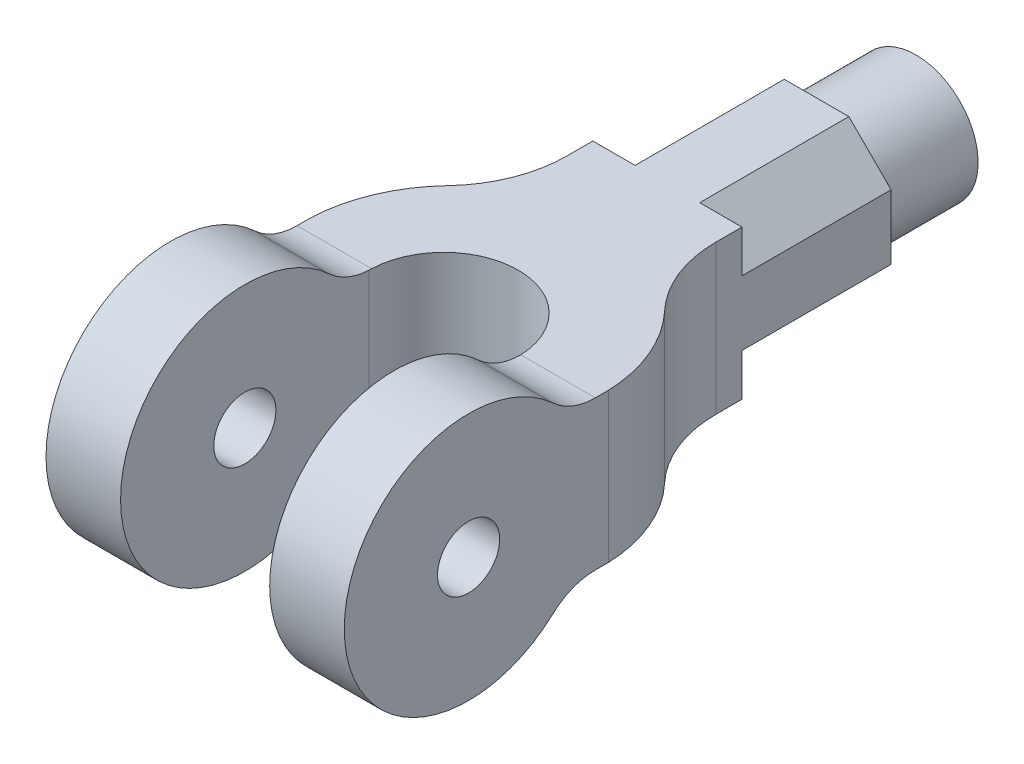
ISO-10303-21;
HEADER;
FILE_DESCRIPTION(('STEP AP214'),'2;1');
FILE_NAME('part.step','',(''),(''),'','','');
FILE_SCHEMA(('AUTOMOTIVE_DESIGN { 1 0 10303 214 1 1 1 1 }'));
ENDSEC;
DATA;
#1=APPLICATION_CONTEXT('core data for automotive mechanical design processes');
#2=APPLICATION_PROTOCOL_DEFINITION('international standard','automotive_design',2000,#1);
#3=PRODUCT_CONTEXT('',#1,'mechanical');
#4=PRODUCT('Part','Part','',(#3));
#5=PRODUCT_RELATED_PRODUCT_CATEGORY('part','',(#4));
#6=PRODUCT_DEFINITION_FORMATION('','',#4);
#7=PRODUCT_DEFINITION_CONTEXT('part definition',#1,'design');
#8=PRODUCT_DEFINITION('design','',#6,#7);
#9=PRODUCT_DEFINITION_SHAPE('','',#8);
#10=(LENGTH_UNIT() NAMED_UNIT(*) SI_UNIT(.MILLI.,.METRE.));
#11=(NAMED_UNIT(*) PLANE_ANGLE_UNIT() SI_UNIT($,.RADIAN.));
#12=(NAMED_UNIT(*) SI_UNIT($,.STERADIAN.) SOLID_ANGLE_UNIT());
#13=UNCERTAINTY_MEASURE_WITH_UNIT(LENGTH_MEASURE(1.E-05),#10,'distance_accuracy_value','');
#14=(GEOMETRIC_REPRESENTATION_CONTEXT(3) GLOBAL_UNCERTAINTY_ASSIGNED_CONTEXT((#13)) GLOBAL_UNIT_ASSIGNED_CONTEXT((#10,
#11,#12)) REPRESENTATION_CONTEXT('',''));
#15=CARTESIAN_POINT('',(0.,0.,0.));
#16=DIRECTION('',(0.,0.,1.));
#17=DIRECTION('',(1.,0.,0.));
#18=AXIS2_PLACEMENT_3D('',#15,#16,#17);
#19=CARTESIAN_POINT('',(0.,100.,0.));
#20=DIRECTION('',(-1.,0.,0.));
#21=DIRECTION('',(0.,0.,1.));
#22=AXIS2_PLACEMENT_3D('',#19,#20,#21);
#23=PLANE('',#22);
#24=CARTESIAN_POINT('',(0.,50.,-50.));
#25=DIRECTION('',(1.,0.,0.));
#26=DIRECTION('',(0.,0.,-1.));
#27=AXIS2_PLACEMENT_3D('',#24,#25,#26);
#28=CIRCLE('',#27,12.5);
#29=CARTESIAN_POINT('',(0.,50.,-62.5));
#30=VERTEX_POINT('',#29);
#31=EDGE_CURVE('E412',#30,#30,#28,.T.);
#32=ORIENTED_EDGE('',*,*,#31,.F.);
#33=EDGE_LOOP('',(#32));
#34=FACE_BOUND('',#33,.T.);
#35=DIRECTION('',(0.,0.,-1.));
#36=VECTOR('',#35,1.);
#37=CARTESIAN_POINT('',(0.,20.,0.));
#38=LINE('',#37,#36);
#39=CARTESIAN_POINT('',(0.,20.,-100.990195135928));
#40=VERTEX_POINT('',#39);
#41=CARTESIAN_POINT('',(0.,20.,-106.283063455047));
#42=VERTEX_POINT('',#41);
#43=EDGE_CURVE('E334',#40,#42,#38,.T.);
#44=ORIENTED_EDGE('',*,*,#43,.T.);
#45=DIRECTION('',(0.,1.,0.));
#46=VECTOR('',#45,1.);
#47=CARTESIAN_POINT('',(0.,0.,-106.283063455047));
#48=LINE('',#47,#46);
#49=CARTESIAN_POINT('',(0.,80.,-106.283063455047));
#50=VERTEX_POINT('',#49);
#51=EDGE_CURVE('E436',#42,#50,#48,.T.);
#52=ORIENTED_EDGE('',*,*,#51,.T.);
#53=DIRECTION('',(0.,0.,-1.));
#54=VECTOR('',#53,1.);
#55=CARTESIAN_POINT('',(0.,80.,0.));
#56=LINE('',#55,#54);
#57=CARTESIAN_POINT('',(0.,80.,-100.990195135928));
#58=VERTEX_POINT('',#57);
#59=EDGE_CURVE('E357',#58,#50,#56,.T.);
#60=ORIENTED_EDGE('',*,*,#59,.F.);
#61=CARTESIAN_POINT('',(0.,105.,-100.990195135928));
#62=DIRECTION('',(1.,0.,0.));
#63=DIRECTION('',(0.,0.,-1.));
#64=AXIS2_PLACEMENT_3D('',#61,#62,#63);
#65=CIRCLE('',#64,25.);
#66=CARTESIAN_POINT('',(0.,86.6666666666667,-83.9934634239519));
#67=VERTEX_POINT('',#66);
#68=EDGE_CURVE('E329',#58,#67,#65,.F.);
#69=ORIENTED_EDGE('',*,*,#68,.T.);
#70=CARTESIAN_POINT('',(0.,50.,-50.));
#71=DIRECTION('',(1.,0.,0.));
#72=DIRECTION('',(0.,0.,-1.));
#73=AXIS2_PLACEMENT_3D('',#70,#71,#72);
#74=CIRCLE('',#73,50.);
#75=CARTESIAN_POINT('',(0.,13.3333333333333,-83.9934634239519));
#76=VERTEX_POINT('',#75);
#77=EDGE_CURVE('E422',#67,#76,#74,.T.);
#78=ORIENTED_EDGE('',*,*,#77,.T.);
#79=CARTESIAN_POINT('',(0.,-5.,-100.990195135928));
#80=DIRECTION('',(1.,0.,0.));
#81=DIRECTION('',(0.,0.,-1.));
#82=AXIS2_PLACEMENT_3D('',#79,#80,#81);
#83=CIRCLE('',#82,25.);
#84=EDGE_CURVE('E337',#76,#40,#83,.F.);
#85=ORIENTED_EDGE('',*,*,#84,.T.);
#86=EDGE_LOOP('',(#44,#52,#60,#69,#78,#85));
#87=FACE_BOUND('',#86,.T.);
#88=ADVANCED_FACE('F85',(#34,#87),#23,.F.);
#89=CARTESIAN_POINT('',(-120.,100.,0.));
#90=DIRECTION('',(1.,0.,0.));
#91=DIRECTION('',(0.,0.,-1.));
#92=AXIS2_PLACEMENT_3D('',#89,#90,#91);
#93=PLANE('',#92);
#94=CARTESIAN_POINT('',(-120.,50.,-50.));
#95=DIRECTION('',(1.,0.,0.));
#96=DIRECTION('',(0.,0.,-1.));
#97=AXIS2_PLACEMENT_3D('',#94,#95,#96);
#98=CIRCLE('',#97,12.5);
#99=CARTESIAN_POINT('',(-120.,50.,-62.5));
#100=VERTEX_POINT('',#99);
#101=EDGE_CURVE('E413',#100,#100,#98,.T.);
#102=ORIENTED_EDGE('',*,*,#101,.T.);
#103=EDGE_LOOP('',(#102));
#104=FACE_BOUND('',#103,.T.);
#105=DIRECTION('',(0.,0.,-1.));
#106=VECTOR('',#105,1.);
#107=CARTESIAN_POINT('',(-120.,20.,0.));
#108=LINE('',#107,#106);
#109=CARTESIAN_POINT('',(-120.,20.,-100.990195135928));
#110=VERTEX_POINT('',#109);
#111=CARTESIAN_POINT('',(-120.,20.,-106.283063455047));
#112=VERTEX_POINT('',#111);
#113=EDGE_CURVE('E333',#110,#112,#108,.T.);
#114=ORIENTED_EDGE('',*,*,#113,.F.);
#115=CARTESIAN_POINT('',(-120.,-5.,-100.990195135928));
#116=DIRECTION('',(1.,0.,0.));
#117=DIRECTION('',(0.,0.,-1.));
#118=AXIS2_PLACEMENT_3D('',#115,#116,#117);
#119=CIRCLE('',#118,25.);
#120=CARTESIAN_POINT('',(-120.,13.3333333333333,-83.9934634239519));
#121=VERTEX_POINT('',#120);
#122=EDGE_CURVE('E331',#121,#110,#119,.F.);
#123=ORIENTED_EDGE('',*,*,#122,.F.);
#124=CARTESIAN_POINT('',(-120.,50.,-50.));
#125=DIRECTION('',(1.,0.,0.));
#126=DIRECTION('',(0.,0.,-1.));
#127=AXIS2_PLACEMENT_3D('',#124,#125,#126);
#128=CIRCLE('',#127,50.);
#129=CARTESIAN_POINT('',(-120.,86.6666666666667,-83.9934634239519));
#130=VERTEX_POINT('',#129);
#131=EDGE_CURVE('E423',#130,#121,#128,.T.);
#132=ORIENTED_EDGE('',*,*,#131,.F.);
#133=CARTESIAN_POINT('',(-120.,105.,-100.990195135928));
#134=DIRECTION('',(1.,0.,0.));
#135=DIRECTION('',(0.,0.,-1.));
#136=AXIS2_PLACEMENT_3D('',#133,#134,#135);
#137=CIRCLE('',#136,25.);
#138=CARTESIAN_POINT('',(-120.,80.,-100.990195135928));
#139=VERTEX_POINT('',#138);
#140=EDGE_CURVE('E353',#139,#130,#137,.F.);
#141=ORIENTED_EDGE('',*,*,#140,.F.);
#142=DIRECTION('',(0.,0.,-1.));
#143=VECTOR('',#142,1.);
#144=CARTESIAN_POINT('',(-120.,80.,0.));
#145=LINE('',#144,#143);
#146=CARTESIAN_POINT('',(-120.,80.,-106.283063455047));
#147=VERTEX_POINT('',#146);
#148=EDGE_CURVE('E356',#139,#147,#145,.T.);
#149=ORIENTED_EDGE('',*,*,#148,.T.);
#150=DIRECTION('',(0.,1.,0.));
#151=VECTOR('',#150,1.);
#152=CARTESIAN_POINT('',(-120.,0.,-106.283063455047));
#153=LINE('',#152,#151);
#154=EDGE_CURVE('E442',#112,#147,#153,.T.);
#155=ORIENTED_EDGE('',*,*,#154,.F.);
#156=EDGE_LOOP('',(#114,#123,#132,#141,#149,#155));
#157=FACE_BOUND('',#156,.T.);
#158=ADVANCED_FACE('F533',(#104,#157),#93,.F.);
#159=CARTESIAN_POINT('',(-30.,0.,0.));
#160=DIRECTION('',(-1.,0.,0.));
#161=DIRECTION('',(0.,0.,1.));
#162=AXIS2_PLACEMENT_3D('',#159,#160,#161);
#163=PLANE('',#162);
#164=CARTESIAN_POINT('',(-30.,50.,-50.));
#165=DIRECTION('',(-1.,0.,0.));
#166=DIRECTION('',(0.,0.,1.));
#167=AXIS2_PLACEMENT_3D('',#164,#165,#166);
#168=CIRCLE('',#167,12.5);
#169=CARTESIAN_POINT('',(-30.,50.,-37.5));
#170=VERTEX_POINT('',#169);
#171=EDGE_CURVE('E419',#170,#170,#168,.T.);
#172=ORIENTED_EDGE('',*,*,#171,.F.);
#173=EDGE_LOOP('',(#172));
#174=FACE_BOUND('',#173,.T.);
#175=DIRECTION('',(0.,1.,0.));
#176=VECTOR('',#175,1.);
#177=CARTESIAN_POINT('',(-30.,0.,-100.));
#178=LINE('',#177,#176);
#179=CARTESIAN_POINT('',(-30.,19.9803825749884,-100.));
#180=VERTEX_POINT('',#179);
#181=CARTESIAN_POINT('',(-30.,80.0196174250116,-100.));
#182=VERTEX_POINT('',#181);
#183=EDGE_CURVE('E432',#180,#182,#178,.T.);
#184=ORIENTED_EDGE('',*,*,#183,.F.);
#185=CARTESIAN_POINT('',(-30.,-5.,-100.990195135928));
#186=DIRECTION('',(-1.,0.,0.));
#187=DIRECTION('',(0.,0.,1.));
#188=AXIS2_PLACEMENT_3D('',#185,#186,#187);
#189=CIRCLE('',#188,25.);
#190=CARTESIAN_POINT('',(-30.,13.3333333333333,-83.9934634239519));
#191=VERTEX_POINT('',#190);
#192=EDGE_CURVE('E406',#180,#191,#189,.F.);
#193=ORIENTED_EDGE('',*,*,#192,.T.);
#194=CARTESIAN_POINT('',(-30.,50.,-50.));
#195=DIRECTION('',(-1.,0.,0.));
#196=DIRECTION('',(0.,0.,1.));
#197=AXIS2_PLACEMENT_3D('',#194,#195,#196);
#198=CIRCLE('',#197,50.);
#199=CARTESIAN_POINT('',(-30.,86.6666666666667,-83.9934634239519));
#200=VERTEX_POINT('',#199);
#201=EDGE_CURVE('E425',#191,#200,#198,.T.);
#202=ORIENTED_EDGE('',*,*,#201,.T.);
#203=CARTESIAN_POINT('',(-30.,105.,-100.990195135928));
#204=DIRECTION('',(-1.,0.,0.));
#205=DIRECTION('',(0.,0.,1.));
#206=AXIS2_PLACEMENT_3D('',#203,#204,#205);
#207=CIRCLE('',#206,25.);
#208=EDGE_CURVE('E401',#200,#182,#207,.F.);
#209=ORIENTED_EDGE('',*,*,#208,.T.);
#210=EDGE_LOOP('',(#184,#193,#202,#209));
#211=FACE_BOUND('',#210,.T.);
#212=ADVANCED_FACE('F526',(#174,#211),#163,.T.);
#213=CARTESIAN_POINT('',(-90.,0.,0.));
#214=DIRECTION('',(-1.,0.,0.));
#215=DIRECTION('',(0.,0.,1.));
#216=AXIS2_PLACEMENT_3D('',#213,#214,#215);
#217=PLANE('',#216);
#218=CARTESIAN_POINT('',(-90.,50.,-50.));
#219=DIRECTION('',(-1.,0.,0.));
#220=DIRECTION('',(0.,0.,1.));
#221=AXIS2_PLACEMENT_3D('',#218,#219,#220);
#222=CIRCLE('',#221,12.5);
#223=CARTESIAN_POINT('',(-90.,50.,-37.5));
#224=VERTEX_POINT('',#223);
#225=EDGE_CURVE('E416',#224,#224,#222,.T.);
#226=ORIENTED_EDGE('',*,*,#225,.T.);
#227=EDGE_LOOP('',(#226));
#228=FACE_BOUND('',#227,.T.);
#229=CARTESIAN_POINT('',(-90.,-5.,-100.990195135928));
#230=DIRECTION('',(-1.,0.,0.));
#231=DIRECTION('',(0.,0.,1.));
#232=AXIS2_PLACEMENT_3D('',#229,#230,#231);
#233=CIRCLE('',#232,25.);
#234=CARTESIAN_POINT('',(-89.9999999999999,19.9803825749884,-100.));
#235=VERTEX_POINT('',#234);
#236=CARTESIAN_POINT('',(-90.,13.3333333333333,-83.9934634239519));
#237=VERTEX_POINT('',#236);
#238=EDGE_CURVE('E409',#235,#237,#233,.F.);
#239=ORIENTED_EDGE('',*,*,#238,.F.);
#240=DIRECTION('',(0.,1.,0.));
#241=VECTOR('',#240,1.);
#242=CARTESIAN_POINT('',(-90.,0.,-100.));
#243=LINE('',#242,#241);
#244=CARTESIAN_POINT('',(-89.9999999999999,80.0196174250116,-100.));
#245=VERTEX_POINT('',#244);
#246=EDGE_CURVE('E451',#235,#245,#243,.T.);
#247=ORIENTED_EDGE('',*,*,#246,.T.);
#248=CARTESIAN_POINT('',(-90.,105.,-100.990195135928));
#249=DIRECTION('',(-1.,0.,0.));
#250=DIRECTION('',(0.,0.,1.));
#251=AXIS2_PLACEMENT_3D('',#248,#249,#250);
#252=CIRCLE('',#251,25.);
#253=CARTESIAN_POINT('',(-90.,86.6666666666667,-83.9934634239519));
#254=VERTEX_POINT('',#253);
#255=EDGE_CURVE('E404',#254,#245,#252,.F.);
#256=ORIENTED_EDGE('',*,*,#255,.F.);
#257=CARTESIAN_POINT('',(-90.,50.,-50.));
#258=DIRECTION('',(-1.,0.,0.));
#259=DIRECTION('',(0.,0.,1.));
#260=AXIS2_PLACEMENT_3D('',#257,#258,#259);
#261=CIRCLE('',#260,50.);
#262=EDGE_CURVE('E454',#237,#254,#261,.T.);
#263=ORIENTED_EDGE('',*,*,#262,.F.);
#264=EDGE_LOOP('',(#239,#247,#256,#263));
#265=FACE_BOUND('',#264,.T.);
#266=ADVANCED_FACE('F523',(#228,#265),#217,.F.);
#267=CARTESIAN_POINT('',(0.,100.,-250.));
#268=DIRECTION('',(0.,0.,1.));
#269=DIRECTION('',(1.,0.,0.));
#270=AXIS2_PLACEMENT_3D('',#267,#268,#269);
#271=PLANE('',#270);
#272=CARTESIAN_POINT('',(-60.,50.,-250.));
#273=DIRECTION('',(0.,0.,-1.));
#274=DIRECTION('',(-1.,0.,0.));
#275=AXIS2_PLACEMENT_3D('',#272,#273,#274);
#276=CIRCLE('',#275,25.);
#277=CARTESIAN_POINT('',(-85.,50.,-250.));
#278=VERTEX_POINT('',#277);
#279=EDGE_CURVE('E12',#278,#278,#276,.T.);
#280=ORIENTED_EDGE('',*,*,#279,.F.);
#281=EDGE_LOOP('',(#280));
#282=FACE_BOUND('',#281,.T.);
#283=DIRECTION('',(0.,1.,0.));
#284=VECTOR('',#283,1.);
#285=CARTESIAN_POINT('',(-30.,0.,-250.));
#286=LINE('',#285,#284);
#287=CARTESIAN_POINT('',(-30.,37.0000000000006,-250.));
#288=VERTEX_POINT('',#287);
#289=CARTESIAN_POINT('',(-30.,62.9999999999993,-250.));
#290=VERTEX_POINT('',#289);
#291=EDGE_CURVE('E433',#288,#290,#286,.T.);
#292=ORIENTED_EDGE('',*,*,#291,.F.);
#293=DIRECTION('',(0.707106781186543,0.707106781186552,0.));
#294=VECTOR('',#293,1.);
#295=CARTESIAN_POINT('',(-33.5000000000005,33.5,-250.));
#296=LINE('',#295,#294);
#297=CARTESIAN_POINT('',(-47.0000000000004,20.,-250.));
#298=VERTEX_POINT('',#297);
#299=EDGE_CURVE('E308',#298,#288,#296,.T.);
#300=ORIENTED_EDGE('',*,*,#299,.F.);
#301=DIRECTION('',(1.,0.,0.));
#302=VECTOR('',#301,1.);
#303=CARTESIAN_POINT('',(-120.,20.,-250.));
#304=LINE('',#303,#302);
#305=CARTESIAN_POINT('',(-73.0000000000003,20.,-250.));
#306=VERTEX_POINT('',#305);
#307=EDGE_CURVE('E347',#306,#298,#304,.T.);
#308=ORIENTED_EDGE('',*,*,#307,.F.);
#309=DIRECTION('',(0.70710678118655,-0.707106781186545,0.));
#310=VECTOR('',#309,1.);
#311=CARTESIAN_POINT('',(-26.4999999999999,-26.5,-250.));
#312=LINE('',#311,#310);
#313=CARTESIAN_POINT('',(-90.,36.9999999999996,-250.));
#314=VERTEX_POINT('',#313);
#315=EDGE_CURVE('E295',#314,#306,#312,.T.);
#316=ORIENTED_EDGE('',*,*,#315,.F.);
#317=DIRECTION('',(0.,1.,0.));
#318=VECTOR('',#317,1.);
#319=CARTESIAN_POINT('',(-90.,0.,-250.));
#320=LINE('',#319,#318);
#321=CARTESIAN_POINT('',(-90.,63.,-250.));
#322=VERTEX_POINT('',#321);
#323=EDGE_CURVE('E445',#314,#322,#320,.T.);
#324=ORIENTED_EDGE('',*,*,#323,.T.);
#325=DIRECTION('',(-0.707106781186548,-0.707106781186548,0.));
#326=VECTOR('',#325,1.);
#327=CARTESIAN_POINT('',(-76.5000000000001,76.5,-250.));
#328=LINE('',#327,#326);
#329=CARTESIAN_POINT('',(-73.,80.,-250.));
#330=VERTEX_POINT('',#329);
#331=EDGE_CURVE('E269',#330,#322,#328,.T.);
#332=ORIENTED_EDGE('',*,*,#331,.F.);
#333=DIRECTION('',(1.,0.,0.));
#334=VECTOR('',#333,1.);
#335=CARTESIAN_POINT('',(-120.,80.,-250.));
#336=LINE('',#335,#334);
#337=CARTESIAN_POINT('',(-47.000000000001,80.,-250.));
#338=VERTEX_POINT('',#337);
#339=EDGE_CURVE('E367',#330,#338,#336,.T.);
#340=ORIENTED_EDGE('',*,*,#339,.T.);
#341=DIRECTION('',(-0.707106781186555,0.70710678118654,0.));
#342=VECTOR('',#341,1.);
#343=CARTESIAN_POINT('',(16.4999999999999,16.5000000000004,-250.));
#344=LINE('',#343,#342);
#345=EDGE_CURVE('E289',#290,#338,#344,.T.);
#346=ORIENTED_EDGE('',*,*,#345,.F.);
#347=EDGE_LOOP('',(#292,#300,#308,#316,#324,#332,#340,#346));
#348=FACE_BOUND('',#347,.T.);
#349=ADVANCED_FACE('F525',(#282,#348),#271,.F.);
#350=CARTESIAN_POINT('',(-60.,0.,-100.));
#351=DIRECTION('',(0.,1.,0.));
#352=DIRECTION('',(0.,0.,1.));
#353=AXIS2_PLACEMENT_3D('',#350,#351,#352);
#354=CYLINDRICAL_SURFACE('',#353,30.);
#355=CARTESIAN_POINT('',(-75.8275095013903,0.,-125.48509256376));
#356=CARTESIAN_POINT('',(-75.9453419018727,0.358389813404725,-125.41192525404));
#357=CARTESIAN_POINT('',(-76.0728764345803,0.711927766841105,-125.331578001654));
#358=CARTESIAN_POINT('',(-76.3441422714206,1.40900113180079,-125.157399989291));
#359=CARTESIAN_POINT('',(-76.487859720743,1.75254478742493,-125.063580744539));
#360=CARTESIAN_POINT('',(-76.7879919439526,2.42880706693594,-124.863543107349));
#361=CARTESIAN_POINT('',(-76.9443626457572,2.76155805131275,-124.757367231674));
#362=CARTESIAN_POINT('',(-77.267691156014,3.41777472815168,-124.532950019776));
#363=CARTESIAN_POINT('',(-77.4346514883452,3.74123818018271,-124.414705803124));
#364=CARTESIAN_POINT('',(-77.9475160759389,4.69728164591437,-124.042967440581));
#365=CARTESIAN_POINT('',(-78.3058698439156,5.31653073050685,-123.772163302132));
#366=CARTESIAN_POINT('',(-79.0421203351865,6.52251393927723,-123.186623209702));
#367=CARTESIAN_POINT('',(-79.4200382267979,7.1092113585892,-122.87183901651));
#368=CARTESIAN_POINT('',(-80.0332816772886,8.02478326006208,-122.332984513027));
#369=CARTESIAN_POINT('',(-80.2657241611245,8.36363846324906,-122.122441780078));
#370=CARTESIAN_POINT('',(-80.7321616366253,9.03015713595407,-121.68592911087));
#371=CARTESIAN_POINT('',(-80.9661566766426,9.35782025493677,-121.45995869208));
#372=CARTESIAN_POINT('',(-81.6679284445677,10.3240452775369,-120.759037096425));
#373=CARTESIAN_POINT('',(-82.1356596397262,10.9460896508651,-120.26093016345));
#374=CARTESIAN_POINT('',(-83.0598406241308,12.1449590889212,-119.202556211609));
#375=CARTESIAN_POINT('',(-83.516281927936,12.7217508091336,-118.642244077417));
#376=CARTESIAN_POINT('',(-84.4074040713771,13.8261350899429,-117.45928387493));
#377=CARTESIAN_POINT('',(-84.8420915990132,14.353742815286,-116.836655144113));
#378=CARTESIAN_POINT('',(-85.5703006530869,15.2235618363571,-115.699965570892));
#379=CARTESIAN_POINT('',(-85.8710459721243,15.5782107910711,-115.200005781658));
#380=CARTESIAN_POINT('',(-86.4510798000706,16.2547596983813,-114.166559470197));
#381=CARTESIAN_POINT('',(-86.7303703085069,16.5766627037158,-113.63307608072));
#382=CARTESIAN_POINT('',(-87.2628402930686,17.183915487848,-112.534331326578));
#383=CARTESIAN_POINT('',(-87.5160593923424,17.4693209001455,-111.969120263849));
#384=CARTESIAN_POINT('',(-87.8732800320289,17.8674921879339,-111.098590933037));
#385=CARTESIAN_POINT('',(-87.9885823708282,17.9952230023255,-110.80463844569));
#386=CARTESIAN_POINT('',(-88.211172660222,18.2402860780741,-110.209345813758));
#387=CARTESIAN_POINT('',(-88.3184584894051,18.3576155884515,-109.908003741491));
#388=CARTESIAN_POINT('',(-88.5950928397935,18.6580766529537,-109.089265592646));
#389=CARTESIAN_POINT('',(-88.7565448902082,18.8311523973944,-108.565427882586));
#390=CARTESIAN_POINT('',(-89.052494190088,19.143807601573,-107.500529935665));
#391=CARTESIAN_POINT('',(-89.1869963227463,19.2833931304804,-106.9594728395));
#392=CARTESIAN_POINT('',(-89.4267044634109,19.5267881537235,-105.863712445825));
#393=CARTESIAN_POINT('',(-89.5319479041772,19.6306434011941,-105.30902758194));
#394=CARTESIAN_POINT('',(-89.7114766042342,19.8009443206672,-104.189217129798));
#395=CARTESIAN_POINT('',(-89.7857750136936,19.8674058874296,-103.624096083264));
#396=CARTESIAN_POINT('',(-89.8958210311018,19.9565087313528,-102.54931302129));
#397=CARTESIAN_POINT('',(-89.9348892238173,19.9831384788008,-102.040324076569));
#398=CARTESIAN_POINT('',(-89.9739568211406,19.9996720025189,-101.275581240453));
#399=CARTESIAN_POINT('',(-89.9837235703496,20.0012832281562,-101.020505246894));
#400=CARTESIAN_POINT('',(-89.9967466695036,19.9966949503395,-100.510242873675));
#401=CARTESIAN_POINT('',(-90.0000026489206,19.9904950023841,-100.25505648856));
#402=CARTESIAN_POINT('',(-90.,19.9803825749884,-100.));
#403=B_SPLINE_CURVE_WITH_KNOTS('',3,(#355,#356,#357,#358,#359,#360,#361,#362,#363,#364,#365,
#366,#367,#368,#369,#370,#371,#372,#373,#374,#375,#376,#377,#378,#379,#380,#381,#382,#383,#384,
#385,#386,#387,#388,#389,#390,#391,#392,#393,#394,#395,#396,#397,#398,#399,#400,#401,#402),
.UNSPECIFIED.,.F.,.F.,(4,2,2,2,2,2,2,2,2,2,2,2,2,2,2,2,2,2,2,2,2,2,2,4),(0.,1.15239393424091,
2.30380865583806,3.45137261392546,4.59921111188271,6.89142599596918,9.18617511127843,
10.5709450115355,11.9557582429984,14.7243917222752,17.4950464800166,20.2648441252873,
22.3114280428238,24.3578209925682,26.4010564573398,27.4226112042936,28.4444353351449,
30.1670290710049,31.8893103984951,33.609378039251,35.3287139853192,36.8605433198757,
37.6261694729858,38.3918391966559),.UNSPECIFIED.);
#404=CARTESIAN_POINT('',(-89.9836541067426,20.,-100.990195135928));
#405=VERTEX_POINT('',#404);
#406=EDGE_CURVE('E88',#405,#235,#403,.T.);
#407=ORIENTED_EDGE('',*,*,#406,.F.);
#408=CARTESIAN_POINT('',(-60.,20.,-100.));
#409=DIRECTION('',(0.,-1.,0.));
#410=DIRECTION('',(0.,0.,-1.));
#411=AXIS2_PLACEMENT_3D('',#408,#409,#410);
#412=CIRCLE('',#411,30.);
#413=CARTESIAN_POINT('',(-30.0163458932574,20.,-100.990195135928));
#414=VERTEX_POINT('',#413);
#415=EDGE_CURVE('E399',#414,#405,#412,.F.);
#416=ORIENTED_EDGE('',*,*,#415,.F.);
#417=CARTESIAN_POINT('',(-30.,19.9803825749884,-100.));
#418=CARTESIAN_POINT('',(-29.9999911814653,19.9921031443495,-100.295470455707));
#419=CARTESIAN_POINT('',(-30.0043649621977,19.9985645579473,-100.591145167604));
#420=CARTESIAN_POINT('',(-30.0218490987905,20.0010070519486,-101.182269660093));
#421=CARTESIAN_POINT('',(-30.0349591559513,19.9969884906565,-101.47771944803));
#422=CARTESIAN_POINT('',(-30.0698764736795,19.9785154975549,-102.067599304468));
#423=CARTESIAN_POINT('',(-30.0916783749131,19.9640674920301,-102.362029888772));
#424=CARTESIAN_POINT('',(-30.1438794394443,19.9248498442532,-102.949415323148));
#425=CARTESIAN_POINT('',(-30.1742786242004,19.9000801762385,-103.242370169535));
#426=CARTESIAN_POINT('',(-30.2776745071463,19.8109243178993,-104.113824557006));
#427=CARTESIAN_POINT('',(-30.3631401956084,19.731545621575,-104.689429220924));
#428=CARTESIAN_POINT('',(-30.5658917389764,19.5342171635541,-105.828209862136));
#429=CARTESIAN_POINT('',(-30.6831809289034,19.416263359019,-106.391384530103));
#430=CARTESIAN_POINT('',(-30.9471578583791,19.1441922940363,-107.500435065409));
#431=CARTESIAN_POINT('',(-31.0937788529506,18.990157003979,-108.04634700618));
#432=CARTESIAN_POINT('',(-31.4140968842998,18.6481818641659,-109.11918962257));
#433=CARTESIAN_POINT('',(-31.5877932751796,18.4602428231851,-109.646120750618));
#434=CARTESIAN_POINT('',(-31.9598586676402,18.0526707480773,-110.679537898761));
#435=CARTESIAN_POINT('',(-32.1582642220975,17.8329906798921,-111.185992125075));
#436=CARTESIAN_POINT('',(-32.5767632205484,17.3646528561437,-112.176002829688));
#437=CARTESIAN_POINT('',(-32.7968593386211,17.1159915269901,-112.659556473826));
#438=CARTESIAN_POINT('',(-33.3398476102806,16.4963438270936,-113.77493325495));
#439=CARTESIAN_POINT('',(-33.6709270208603,16.1138479645931,-114.396414454785));
#440=CARTESIAN_POINT('',(-34.3614999647444,15.3046093911249,-115.593106301892));
#441=CARTESIAN_POINT('',(-34.7210031017041,14.8778517098959,-116.168301176594));
#442=CARTESIAN_POINT('',(-35.4627230432031,13.9833620017027,-117.273272681042));
#443=CARTESIAN_POINT('',(-35.8449985353552,13.5155224895297,-117.802922531596));
#444=CARTESIAN_POINT('',(-36.6247714497573,12.5432717814187,-118.815068057127));
#445=CARTESIAN_POINT('',(-37.0222672254673,12.038864536157,-119.297568812776));
#446=CARTESIAN_POINT('',(-37.8343354609938,10.9845616795248,-120.225511017876));
#447=CARTESIAN_POINT('',(-38.2490912718205,10.4339306636101,-120.669955305113));
#448=CARTESIAN_POINT('',(-39.0798729287748,9.29757613830418,-121.510403914249));
#449=CARTESIAN_POINT('',(-39.4958990332364,8.71184496723211,-121.906397602526));
#450=CARTESIAN_POINT('',(-40.3181867322247,7.50753443195654,-122.647977132005));
#451=CARTESIAN_POINT('',(-40.7244843256702,6.88911782592514,-122.993785567575));
#452=CARTESIAN_POINT('',(-41.3190652656405,5.93383049801359,-123.475262582437));
#453=CARTESIAN_POINT('',(-41.5147609425322,5.61082747391488,-123.629534284819));
#454=CARTESIAN_POINT('',(-41.8993601836398,4.95514724764711,-123.925417792326));
#455=CARTESIAN_POINT('',(-42.0882646775356,4.62247138100809,-124.067031334266));
#456=CARTESIAN_POINT('',(-42.4559043938873,3.94925557890831,-124.336316229696));
#457=CARTESIAN_POINT('',(-42.6346991503793,3.6087830728379,-124.46407444937));
#458=CARTESIAN_POINT('',(-42.9808534548276,2.91758063010064,-124.706137847941));
#459=CARTESIAN_POINT('',(-43.1482181596378,2.56685542247274,-124.820449110695));
#460=CARTESIAN_POINT('',(-43.4691990562214,1.8533687959625,-125.035374687706));
#461=CARTESIAN_POINT('',(-43.6227642525342,1.49056901805244,-125.13593886043));
#462=CARTESIAN_POINT('',(-43.9120182731903,0.753672874476581,-125.32206005966));
#463=CARTESIAN_POINT('',(-44.0476859514299,0.379563776676371,-125.407599372981));
#464=CARTESIAN_POINT('',(-44.1724904986097,0.,-125.48509256376));
#465=B_SPLINE_CURVE_WITH_KNOTS('',3,(#417,#418,#419,#420,#421,#422,#423,#424,#425,#426,#427,
#428,#429,#430,#431,#432,#433,#434,#435,#436,#437,#438,#439,#440,#441,#442,#443,#444,#445,#446,
#447,#448,#449,#450,#451,#452,#453,#454,#455,#456,#457,#458,#459,#460,#461,#462,#463,#464),
.UNSPECIFIED.,.F.,.F.,(4,2,2,2,2,2,2,2,2,2,2,2,2,2,2,2,2,2,2,2,2,2,2,4),(0.,0.88702157945277,
1.77401283254117,2.66045801643428,3.54690541287115,5.3062732485925,7.06582553280981,
8.82141856192586,10.5769697168552,12.3351494576459,14.0935462240124,16.4940914992236,
18.8954513525921,21.3032927375818,23.7108743726276,26.1692726120446,28.6282094405583,
31.0758826064284,32.2994541209097,33.5228574915904,34.7380832987387,35.9527571646658,
37.1717495488665,38.392169526716),.UNSPECIFIED.);
#466=EDGE_CURVE('E597',#180,#414,#465,.T.);
#467=ORIENTED_EDGE('',*,*,#466,.F.);
#468=ORIENTED_EDGE('',*,*,#183,.T.);
#469=CARTESIAN_POINT('',(-30.0163458932574,80.,-100.990195135928));
#470=CARTESIAN_POINT('',(-30.0108963785485,79.9999994298494,-100.825142813205));
#471=CARTESIAN_POINT('',(-30.0068094634226,80.0016339301918,-100.660100390517));
#472=CARTESIAN_POINT('',(-30.0013608323368,80.0081730718623,-100.330035345207));
#473=CARTESIAN_POINT('',(-29.9999991163769,80.0130777131905,-100.165012722587));
#474=CARTESIAN_POINT('',(-30.,80.0196174250116,-100.));
#475=B_SPLINE_CURVE_WITH_KNOTS('',3,(#469,#470,#471,#472,#473,#474),.UNSPECIFIED.,.F.,.F.,(4,2,
4),(0.,0.495303323006999,0.990606646014001),.UNSPECIFIED.);
#476=CARTESIAN_POINT('',(-30.0163458932574,80.,-100.990195135928));
#477=VERTEX_POINT('',#476);
#478=EDGE_CURVE('E466',#477,#182,#475,.T.);
#479=ORIENTED_EDGE('',*,*,#478,.F.);
#480=CARTESIAN_POINT('',(-60.,80.,-100.));
#481=DIRECTION('',(0.,-1.,0.));
#482=DIRECTION('',(0.,0.,-1.));
#483=AXIS2_PLACEMENT_3D('',#480,#481,#482);
#484=CIRCLE('',#483,30.);
#485=CARTESIAN_POINT('',(-89.9836541067426,80.,-100.990195135928));
#486=VERTEX_POINT('',#485);
#487=EDGE_CURVE('E383',#477,#486,#484,.F.);
#488=ORIENTED_EDGE('',*,*,#487,.T.);
#489=CARTESIAN_POINT('',(-89.9999999999999,80.0196174250116,-100.));
#490=CARTESIAN_POINT('',(-90.000000883623,80.0130777131905,-100.165012722587));
#491=CARTESIAN_POINT('',(-89.9986391676632,80.0081730718623,-100.330035345207));
#492=CARTESIAN_POINT('',(-89.9931905365774,80.0016339301918,-100.660100390517));
#493=CARTESIAN_POINT('',(-89.9891036214515,79.9999994298494,-100.825142813205));
#494=CARTESIAN_POINT('',(-89.9836541067426,80.,-100.990195135928));
#495=B_SPLINE_CURVE_WITH_KNOTS('',3,(#489,#490,#491,#492,#493,#494),.UNSPECIFIED.,.F.,.F.,(4,2,
4),(0.,0.495303323007001,0.990606646014001),.UNSPECIFIED.);
#496=EDGE_CURVE('E473',#245,#486,#495,.T.);
#497=ORIENTED_EDGE('',*,*,#496,.F.);
#498=ORIENTED_EDGE('',*,*,#246,.F.);
#499=EDGE_LOOP('',(#407,#416,#467,#468,#479,#488,#497,#498));
#500=FACE_BOUND('',#499,.T.);
#501=ADVANCED_FACE('F478',(#500),#354,.F.);
#502=CARTESIAN_POINT('',(20.,0.,-179.561593793097));
#503=DIRECTION('',(0.,1.,0.));
#504=DIRECTION('',(0.,0.,1.));
#505=AXIS2_PLACEMENT_3D('',#502,#503,#504);
#506=CYLINDRICAL_SURFACE('',#505,50.);
#507=DIRECTION('',(0.,1.,0.));
#508=VECTOR('',#507,1.);
#509=CARTESIAN_POINT('',(-16.3492880511663,0.,-145.228967063216));
#510=LINE('',#509,#508);
#511=CARTESIAN_POINT('',(-16.3492880511663,20.,-145.228967063216));
#512=VERTEX_POINT('',#511);
#513=CARTESIAN_POINT('',(-16.3492880511663,80.,-145.228967063216));
#514=VERTEX_POINT('',#513);
#515=EDGE_CURVE('E439',#512,#514,#510,.T.);
#516=ORIENTED_EDGE('',*,*,#515,.F.);
#517=CARTESIAN_POINT('',(20.,20.,-179.561593793097));
#518=DIRECTION('',(0.,-1.,0.));
#519=DIRECTION('',(0.,0.,-1.));
#520=AXIS2_PLACEMENT_3D('',#517,#518,#519);
#521=CIRCLE('',#520,50.);
#522=CARTESIAN_POINT('',(-30.,20.,-179.561593793097));
#523=VERTEX_POINT('',#522);
#524=EDGE_CURVE('E394',#512,#523,#521,.T.);
#525=ORIENTED_EDGE('',*,*,#524,.T.);
#526=DIRECTION('',(0.,1.,0.));
#527=VECTOR('',#526,1.);
#528=CARTESIAN_POINT('',(-30.,0.,-179.561593793097));
#529=LINE('',#528,#527);
#530=CARTESIAN_POINT('',(-30.,80.,-179.561593793097));
#531=VERTEX_POINT('',#530);
#532=EDGE_CURVE('E429',#523,#531,#529,.T.);
#533=ORIENTED_EDGE('',*,*,#532,.T.);
#534=CARTESIAN_POINT('',(20.,80.,-179.561593793097));
#535=DIRECTION('',(0.,-1.,0.));
#536=DIRECTION('',(0.,0.,-1.));
#537=AXIS2_PLACEMENT_3D('',#534,#535,#536);
#538=CIRCLE('',#537,50.);
#539=EDGE_CURVE('E378',#514,#531,#538,.T.);
#540=ORIENTED_EDGE('',*,*,#539,.F.);
#541=EDGE_LOOP('',(#516,#525,#533,#540));
#542=FACE_BOUND('',#541,.T.);
#543=ADVANCED_FACE('F506',(#542),#506,.F.);
#544=CARTESIAN_POINT('',(-30.,0.,0.));
#545=DIRECTION('',(-1.,0.,0.));
#546=DIRECTION('',(0.,0.,1.));
#547=AXIS2_PLACEMENT_3D('',#544,#545,#546);
#548=PLANE('',#547);
#549=DIRECTION('',(0.,-1.,0.));
#550=VECTOR('',#549,1.);
#551=CARTESIAN_POINT('',(-30.,0.,-190.));
#552=LINE('',#551,#550);
#553=CARTESIAN_POINT('',(-30.,37.0000000000006,-190.));
#554=VERTEX_POINT('',#553);
#555=CARTESIAN_POINT('',(-30.,20.,-190.));
#556=VERTEX_POINT('',#555);
#557=EDGE_CURVE('E305',#554,#556,#552,.T.);
#558=ORIENTED_EDGE('',*,*,#557,.F.);
#559=DIRECTION('',(0.,0.,-1.));
#560=VECTOR('',#559,1.);
#561=CARTESIAN_POINT('',(-30.,37.0000000000006,-190.));
#562=LINE('',#561,#560);
#563=EDGE_CURVE('E301',#554,#288,#562,.T.);
#564=ORIENTED_EDGE('',*,*,#563,.T.);
#565=ORIENTED_EDGE('',*,*,#291,.T.);
#566=DIRECTION('',(0.,0.,-1.));
#567=VECTOR('',#566,1.);
#568=CARTESIAN_POINT('',(-30.,62.9999999999993,-190.));
#569=LINE('',#568,#567);
#570=CARTESIAN_POINT('',(-30.,62.9999999999993,-190.));
#571=VERTEX_POINT('',#570);
#572=EDGE_CURVE('E324',#571,#290,#569,.T.);
#573=ORIENTED_EDGE('',*,*,#572,.F.);
#574=DIRECTION('',(0.,-1.,0.));
#575=VECTOR('',#574,1.);
#576=CARTESIAN_POINT('',(-30.,0.,-190.));
#577=LINE('',#576,#575);
#578=CARTESIAN_POINT('',(-30.,80.,-190.));
#579=VERTEX_POINT('',#578);
#580=EDGE_CURVE('E319',#579,#571,#577,.T.);
#581=ORIENTED_EDGE('',*,*,#580,.F.);
#582=DIRECTION('',(0.,0.,1.));
#583=VECTOR('',#582,1.);
#584=CARTESIAN_POINT('',(-30.,80.,0.));
#585=LINE('',#584,#583);
#586=EDGE_CURVE('E381',#579,#531,#585,.T.);
#587=ORIENTED_EDGE('',*,*,#586,.T.);
#588=ORIENTED_EDGE('',*,*,#532,.F.);
#589=DIRECTION('',(0.,0.,1.));
#590=VECTOR('',#589,1.);
#591=CARTESIAN_POINT('',(-30.,20.,0.));
#592=LINE('',#591,#590);
#593=EDGE_CURVE('E397',#556,#523,#592,.T.);
#594=ORIENTED_EDGE('',*,*,#593,.F.);
#595=EDGE_LOOP('',(#558,#564,#565,#573,#581,#587,#588,#594));
#596=FACE_BOUND('',#595,.T.);
#597=ADVANCED_FACE('F502',(#596),#548,.F.);
#598=CARTESIAN_POINT('',(-60.,0.,-104.));
#599=DIRECTION('',(0.,1.,0.));
#600=DIRECTION('',(0.,0.,1.));
#601=AXIS2_PLACEMENT_3D('',#598,#599,#600);
#602=CYLINDRICAL_SURFACE('',#601,60.0434207781316);
#603=ORIENTED_EDGE('',*,*,#51,.F.);
#604=CARTESIAN_POINT('',(-60.,20.,-104.));
#605=DIRECTION('',(0.,-1.,0.));
#606=DIRECTION('',(0.,0.,-1.));
#607=AXIS2_PLACEMENT_3D('',#604,#605,#606);
#608=CIRCLE('',#607,60.0434207781316);
#609=EDGE_CURVE('E391',#42,#512,#608,.F.);
#610=ORIENTED_EDGE('',*,*,#609,.T.);
#611=ORIENTED_EDGE('',*,*,#515,.T.);
#612=CARTESIAN_POINT('',(-60.,80.,-104.));
#613=DIRECTION('',(0.,-1.,0.));
#614=DIRECTION('',(0.,0.,-1.));
#615=AXIS2_PLACEMENT_3D('',#612,#613,#614);
#616=CIRCLE('',#615,60.0434207781316);
#617=EDGE_CURVE('E376',#50,#514,#616,.F.);
#618=ORIENTED_EDGE('',*,*,#617,.F.);
#619=EDGE_LOOP('',(#603,#610,#611,#618));
#620=FACE_BOUND('',#619,.T.);
#621=ADVANCED_FACE('F505',(#620),#602,.T.);
#622=CARTESIAN_POINT('',(-60.,0.,-104.));
#623=DIRECTION('',(0.,1.,0.));
#624=DIRECTION('',(0.,0.,1.));
#625=AXIS2_PLACEMENT_3D('',#622,#623,#624);
#626=CYLINDRICAL_SURFACE('',#625,60.0434207781316);
#627=DIRECTION('',(0.,1.,0.));
#628=VECTOR('',#627,1.);
#629=CARTESIAN_POINT('',(-103.650711948834,0.,-145.228967063216));
#630=LINE('',#629,#628);
#631=CARTESIAN_POINT('',(-103.650711948834,20.,-145.228967063216));
#632=VERTEX_POINT('',#631);
#633=CARTESIAN_POINT('',(-103.650711948834,80.,-145.228967063216));
#634=VERTEX_POINT('',#633);
#635=EDGE_CURVE('E428',#632,#634,#630,.T.);
#636=ORIENTED_EDGE('',*,*,#635,.F.);
#637=CARTESIAN_POINT('',(-60.,20.,-104.));
#638=DIRECTION('',(0.,-1.,0.));
#639=DIRECTION('',(0.,0.,-1.));
#640=AXIS2_PLACEMENT_3D('',#637,#638,#639);
#641=CIRCLE('',#640,60.0434207781316);
#642=EDGE_CURVE('E388',#632,#112,#641,.F.);
#643=ORIENTED_EDGE('',*,*,#642,.T.);
#644=ORIENTED_EDGE('',*,*,#154,.T.);
#645=CARTESIAN_POINT('',(-60.,80.,-104.));
#646=DIRECTION('',(0.,-1.,0.));
#647=DIRECTION('',(0.,0.,-1.));
#648=AXIS2_PLACEMENT_3D('',#645,#646,#647);
#649=CIRCLE('',#648,60.0434207781316);
#650=EDGE_CURVE('E374',#634,#147,#649,.F.);
#651=ORIENTED_EDGE('',*,*,#650,.F.);
#652=EDGE_LOOP('',(#636,#643,#644,#651));
#653=FACE_BOUND('',#652,.T.);
#654=ADVANCED_FACE('F510',(#653),#626,.T.);
#655=CARTESIAN_POINT('',(-90.,0.,0.));
#656=DIRECTION('',(-1.,0.,0.));
#657=DIRECTION('',(0.,0.,1.));
#658=AXIS2_PLACEMENT_3D('',#655,#656,#657);
#659=PLANE('',#658);
#660=DIRECTION('',(0.,0.,-1.));
#661=VECTOR('',#660,1.);
#662=CARTESIAN_POINT('',(-90.,36.9999999999996,-190.));
#663=LINE('',#662,#661);
#664=CARTESIAN_POINT('',(-90.,36.9999999999996,-190.));
#665=VERTEX_POINT('',#664);
#666=EDGE_CURVE('E299',#665,#314,#663,.T.);
#667=ORIENTED_EDGE('',*,*,#666,.F.);
#668=DIRECTION('',(0.,1.,0.));
#669=VECTOR('',#668,1.);
#670=CARTESIAN_POINT('',(-90.,0.,-190.));
#671=LINE('',#670,#669);
#672=CARTESIAN_POINT('',(-90.,20.,-190.));
#673=VERTEX_POINT('',#672);
#674=EDGE_CURVE('E291',#673,#665,#671,.T.);
#675=ORIENTED_EDGE('',*,*,#674,.F.);
#676=DIRECTION('',(0.,0.,1.));
#677=VECTOR('',#676,1.);
#678=CARTESIAN_POINT('',(-90.,20.,0.));
#679=LINE('',#678,#677);
#680=CARTESIAN_POINT('',(-90.,20.,-179.561593793097));
#681=VERTEX_POINT('',#680);
#682=EDGE_CURVE('E386',#673,#681,#679,.T.);
#683=ORIENTED_EDGE('',*,*,#682,.T.);
#684=DIRECTION('',(0.,1.,0.));
#685=VECTOR('',#684,1.);
#686=CARTESIAN_POINT('',(-90.,0.,-179.561593793097));
#687=LINE('',#686,#685);
#688=CARTESIAN_POINT('',(-90.,80.,-179.561593793097));
#689=VERTEX_POINT('',#688);
#690=EDGE_CURVE('E447',#681,#689,#687,.T.);
#691=ORIENTED_EDGE('',*,*,#690,.T.);
#692=DIRECTION('',(0.,0.,1.));
#693=VECTOR('',#692,1.);
#694=CARTESIAN_POINT('',(-90.,80.,0.));
#695=LINE('',#694,#693);
#696=CARTESIAN_POINT('',(-90.,80.,-190.));
#697=VERTEX_POINT('',#696);
#698=EDGE_CURVE('E283',#697,#689,#695,.T.);
#699=ORIENTED_EDGE('',*,*,#698,.F.);
#700=DIRECTION('',(0.,1.,0.));
#701=VECTOR('',#700,1.);
#702=CARTESIAN_POINT('',(-90.,0.,-190.));
#703=LINE('',#702,#701);
#704=CARTESIAN_POINT('',(-90.,63.,-190.));
#705=VERTEX_POINT('',#704);
#706=EDGE_CURVE('E114',#705,#697,#703,.T.);
#707=ORIENTED_EDGE('',*,*,#706,.F.);
#708=DIRECTION('',(0.,0.,-1.));
#709=VECTOR('',#708,1.);
#710=CARTESIAN_POINT('',(-90.,63.,-190.));
#711=LINE('',#710,#709);
#712=EDGE_CURVE('E265',#705,#322,#711,.T.);
#713=ORIENTED_EDGE('',*,*,#712,.T.);
#714=ORIENTED_EDGE('',*,*,#323,.F.);
#715=EDGE_LOOP('',(#667,#675,#683,#691,#699,#707,#713,#714));
#716=FACE_BOUND('',#715,.T.);
#717=ADVANCED_FACE('F281',(#716),#659,.T.);
#718=CARTESIAN_POINT('',(-140.,0.,-179.561593793097));
#719=DIRECTION('',(0.,1.,0.));
#720=DIRECTION('',(0.,0.,1.));
#721=AXIS2_PLACEMENT_3D('',#718,#719,#720);
#722=CYLINDRICAL_SURFACE('',#721,50.);
#723=CARTESIAN_POINT('',(-140.,20.,-179.561593793097));
#724=DIRECTION('',(0.,-1.,0.));
#725=DIRECTION('',(0.,0.,-1.));
#726=AXIS2_PLACEMENT_3D('',#723,#724,#725);
#727=CIRCLE('',#726,50.);
#728=EDGE_CURVE('E463',#632,#681,#727,.F.);
#729=ORIENTED_EDGE('',*,*,#728,.F.);
#730=ORIENTED_EDGE('',*,*,#635,.T.);
#731=CARTESIAN_POINT('',(-140.,80.,-179.561593793097));
#732=DIRECTION('',(0.,-1.,0.));
#733=DIRECTION('',(0.,0.,-1.));
#734=AXIS2_PLACEMENT_3D('',#731,#732,#733);
#735=CIRCLE('',#734,50.);
#736=EDGE_CURVE('E458',#634,#689,#735,.F.);
#737=ORIENTED_EDGE('',*,*,#736,.T.);
#738=ORIENTED_EDGE('',*,*,#690,.F.);
#739=EDGE_LOOP('',(#729,#730,#737,#738));
#740=FACE_BOUND('',#739,.T.);
#741=ADVANCED_FACE('F517',(#740),#722,.F.);
#742=CARTESIAN_POINT('',(-120.,50.,-50.));
#743=DIRECTION('',(1.,0.,0.));
#744=DIRECTION('',(0.,0.,-1.));
#745=AXIS2_PLACEMENT_3D('',#742,#743,#744);
#746=CYLINDRICAL_SURFACE('',#745,50.);
#747=ORIENTED_EDGE('',*,*,#262,.T.);
#748=DIRECTION('',(1.,0.,0.));
#749=VECTOR('',#748,1.);
#750=CARTESIAN_POINT('',(-120.,86.6666666666667,-83.9934634239519));
#751=LINE('',#750,#749);
#752=EDGE_CURVE('E340',#130,#254,#751,.T.);
#753=ORIENTED_EDGE('',*,*,#752,.F.);
#754=ORIENTED_EDGE('',*,*,#131,.T.);
#755=DIRECTION('',(1.,0.,0.));
#756=VECTOR('',#755,1.);
#757=CARTESIAN_POINT('',(-120.,13.3333333333333,-83.9934634239519));
#758=LINE('',#757,#756);
#759=EDGE_CURVE('E350',#121,#237,#758,.T.);
#760=ORIENTED_EDGE('',*,*,#759,.T.);
#761=EDGE_LOOP('',(#747,#753,#754,#760));
#762=FACE_BOUND('',#761,.T.);
#763=ADVANCED_FACE('F500',(#762),#746,.T.);
#764=ORIENTED_EDGE('',*,*,#201,.F.);
#765=EDGE_CURVE('E336',#191,#76,#758,.T.);
#766=ORIENTED_EDGE('',*,*,#765,.T.);
#767=ORIENTED_EDGE('',*,*,#77,.F.);
#768=EDGE_CURVE('E366',#200,#67,#751,.T.);
#769=ORIENTED_EDGE('',*,*,#768,.F.);
#770=EDGE_LOOP('',(#764,#766,#767,#769));
#771=FACE_BOUND('',#770,.T.);
#772=ADVANCED_FACE('F497',(#771),#746,.T.);
#773=CARTESIAN_POINT('',(-120.,50.,-50.));
#774=DIRECTION('',(1.,0.,0.));
#775=DIRECTION('',(0.,0.,-1.));
#776=AXIS2_PLACEMENT_3D('',#773,#774,#775);
#777=CYLINDRICAL_SURFACE('',#776,12.5);
#778=ORIENTED_EDGE('',*,*,#101,.F.);
#779=EDGE_LOOP('',(#778));
#780=FACE_BOUND('',#779,.T.);
#781=ORIENTED_EDGE('',*,*,#225,.F.);
#782=EDGE_LOOP('',(#781));
#783=FACE_BOUND('',#782,.T.);
#784=ADVANCED_FACE('F495',(#780,#783),#777,.F.);
#785=ORIENTED_EDGE('',*,*,#171,.T.);
#786=EDGE_LOOP('',(#785));
#787=FACE_BOUND('',#786,.T.);
#788=ORIENTED_EDGE('',*,*,#31,.T.);
#789=EDGE_LOOP('',(#788));
#790=FACE_BOUND('',#789,.T.);
#791=ADVANCED_FACE('F491',(#787,#790),#777,.F.);
#792=CARTESIAN_POINT('',(-120.,105.,-100.990195135928));
#793=DIRECTION('',(1.,0.,0.));
#794=DIRECTION('',(0.,0.,-1.));
#795=AXIS2_PLACEMENT_3D('',#792,#793,#794);
#796=CYLINDRICAL_SURFACE('',#795,25.);
#797=ORIENTED_EDGE('',*,*,#255,.T.);
#798=ORIENTED_EDGE('',*,*,#496,.T.);
#799=DIRECTION('',(1.,0.,0.));
#800=VECTOR('',#799,1.);
#801=CARTESIAN_POINT('',(-120.,80.,-100.990195135928));
#802=LINE('',#801,#800);
#803=EDGE_CURVE('E370',#139,#486,#802,.T.);
#804=ORIENTED_EDGE('',*,*,#803,.F.);
#805=ORIENTED_EDGE('',*,*,#140,.T.);
#806=ORIENTED_EDGE('',*,*,#752,.T.);
#807=EDGE_LOOP('',(#797,#798,#804,#805,#806));
#808=FACE_BOUND('',#807,.T.);
#809=ADVANCED_FACE('F490',(#808),#796,.F.);
#810=CARTESIAN_POINT('',(-120.,80.,0.));
#811=DIRECTION('',(0.,-1.,0.));
#812=DIRECTION('',(0.,0.,-1.));
#813=AXIS2_PLACEMENT_3D('',#810,#811,#812);
#814=PLANE('',#813);
#815=ORIENTED_EDGE('',*,*,#339,.F.);
#816=DIRECTION('',(0.,0.,-1.));
#817=VECTOR('',#816,1.);
#818=CARTESIAN_POINT('',(-73.,80.,-190.));
#819=LINE('',#818,#817);
#820=CARTESIAN_POINT('',(-73.,80.,-190.));
#821=VERTEX_POINT('',#820);
#822=EDGE_CURVE('E273',#821,#330,#819,.T.);
#823=ORIENTED_EDGE('',*,*,#822,.F.);
#824=DIRECTION('',(1.,0.,0.));
#825=VECTOR('',#824,1.);
#826=CARTESIAN_POINT('',(0.,80.,-190.));
#827=LINE('',#826,#825);
#828=EDGE_CURVE('E274',#697,#821,#827,.T.);
#829=ORIENTED_EDGE('',*,*,#828,.F.);
#830=ORIENTED_EDGE('',*,*,#698,.T.);
#831=ORIENTED_EDGE('',*,*,#736,.F.);
#832=ORIENTED_EDGE('',*,*,#650,.T.);
#833=ORIENTED_EDGE('',*,*,#148,.F.);
#834=ORIENTED_EDGE('',*,*,#803,.T.);
#835=ORIENTED_EDGE('',*,*,#487,.F.);
#836=EDGE_CURVE('E360',#477,#58,#802,.T.);
#837=ORIENTED_EDGE('',*,*,#836,.T.);
#838=ORIENTED_EDGE('',*,*,#59,.T.);
#839=ORIENTED_EDGE('',*,*,#617,.T.);
#840=ORIENTED_EDGE('',*,*,#539,.T.);
#841=ORIENTED_EDGE('',*,*,#586,.F.);
#842=DIRECTION('',(1.,0.,0.));
#843=VECTOR('',#842,1.);
#844=CARTESIAN_POINT('',(0.,80.,-190.));
#845=LINE('',#844,#843);
#846=CARTESIAN_POINT('',(-47.000000000001,80.,-190.));
#847=VERTEX_POINT('',#846);
#848=EDGE_CURVE('E322',#847,#579,#845,.T.);
#849=ORIENTED_EDGE('',*,*,#848,.F.);
#850=DIRECTION('',(0.,0.,-1.));
#851=VECTOR('',#850,1.);
#852=CARTESIAN_POINT('',(-47.000000000001,80.,-190.));
#853=LINE('',#852,#851);
#854=EDGE_CURVE('E326',#847,#338,#853,.T.);
#855=ORIENTED_EDGE('',*,*,#854,.T.);
#856=EDGE_LOOP('',(#815,#823,#829,#830,#831,#832,#833,#834,#835,#837,#838,#839,#840,#841,#849,#855));
#857=FACE_BOUND('',#856,.T.);
#858=ADVANCED_FACE('F488',(#857),#814,.F.);
#859=ORIENTED_EDGE('',*,*,#768,.T.);
#860=ORIENTED_EDGE('',*,*,#68,.F.);
#861=ORIENTED_EDGE('',*,*,#836,.F.);
#862=ORIENTED_EDGE('',*,*,#478,.T.);
#863=ORIENTED_EDGE('',*,*,#208,.F.);
#864=EDGE_LOOP('',(#859,#860,#861,#862,#863));
#865=FACE_BOUND('',#864,.T.);
#866=ADVANCED_FACE('F482',(#865),#796,.F.);
#867=CARTESIAN_POINT('',(-120.,-5.,-100.990195135928));
#868=DIRECTION('',(1.,0.,0.));
#869=DIRECTION('',(0.,0.,-1.));
#870=AXIS2_PLACEMENT_3D('',#867,#868,#869);
#871=CYLINDRICAL_SURFACE('',#870,25.);
#872=ORIENTED_EDGE('',*,*,#238,.T.);
#873=ORIENTED_EDGE('',*,*,#759,.F.);
#874=ORIENTED_EDGE('',*,*,#122,.T.);
#875=DIRECTION('',(1.,0.,0.));
#876=VECTOR('',#875,1.);
#877=CARTESIAN_POINT('',(-120.,20.,-100.990195135928));
#878=LINE('',#877,#876);
#879=EDGE_CURVE('E343',#110,#405,#878,.T.);
#880=ORIENTED_EDGE('',*,*,#879,.T.);
#881=ORIENTED_EDGE('',*,*,#406,.T.);
#882=EDGE_LOOP('',(#872,#873,#874,#880,#881));
#883=FACE_BOUND('',#882,.T.);
#884=ADVANCED_FACE('F487',(#883),#871,.F.);
#885=CARTESIAN_POINT('',(-120.,20.,0.));
#886=DIRECTION('',(0.,-1.,0.));
#887=DIRECTION('',(0.,0.,-1.));
#888=AXIS2_PLACEMENT_3D('',#885,#886,#887);
#889=PLANE('',#888);
#890=DIRECTION('',(0.,0.,-1.));
#891=VECTOR('',#890,1.);
#892=CARTESIAN_POINT('',(-47.0000000000003,20.,-190.));
#893=LINE('',#892,#891);
#894=CARTESIAN_POINT('',(-47.0000000000003,20.,-190.));
#895=VERTEX_POINT('',#894);
#896=EDGE_CURVE('E313',#895,#298,#893,.T.);
#897=ORIENTED_EDGE('',*,*,#896,.F.);
#898=DIRECTION('',(-1.,0.,0.));
#899=VECTOR('',#898,1.);
#900=CARTESIAN_POINT('',(0.,20.,-190.));
#901=LINE('',#900,#899);
#902=EDGE_CURVE('E307',#556,#895,#901,.T.);
#903=ORIENTED_EDGE('',*,*,#902,.F.);
#904=ORIENTED_EDGE('',*,*,#593,.T.);
#905=ORIENTED_EDGE('',*,*,#524,.F.);
#906=ORIENTED_EDGE('',*,*,#609,.F.);
#907=ORIENTED_EDGE('',*,*,#43,.F.);
#908=EDGE_CURVE('E346',#414,#40,#878,.T.);
#909=ORIENTED_EDGE('',*,*,#908,.F.);
#910=ORIENTED_EDGE('',*,*,#415,.T.);
#911=ORIENTED_EDGE('',*,*,#879,.F.);
#912=ORIENTED_EDGE('',*,*,#113,.T.);
#913=ORIENTED_EDGE('',*,*,#642,.F.);
#914=ORIENTED_EDGE('',*,*,#728,.T.);
#915=ORIENTED_EDGE('',*,*,#682,.F.);
#916=DIRECTION('',(-1.,0.,0.));
#917=VECTOR('',#916,1.);
#918=CARTESIAN_POINT('',(0.,20.,-190.));
#919=LINE('',#918,#917);
#920=CARTESIAN_POINT('',(-73.0000000000003,20.,-190.));
#921=VERTEX_POINT('',#920);
#922=EDGE_CURVE('E297',#921,#673,#919,.T.);
#923=ORIENTED_EDGE('',*,*,#922,.F.);
#924=DIRECTION('',(0.,0.,-1.));
#925=VECTOR('',#924,1.);
#926=CARTESIAN_POINT('',(-73.0000000000003,20.,-190.));
#927=LINE('',#926,#925);
#928=EDGE_CURVE('E288',#921,#306,#927,.T.);
#929=ORIENTED_EDGE('',*,*,#928,.T.);
#930=ORIENTED_EDGE('',*,*,#307,.T.);
#931=EDGE_LOOP('',(#897,#903,#904,#905,#906,#907,#909,#910,#911,#912,#913,#914,#915,#923,#929,#930));
#932=FACE_BOUND('',#931,.T.);
#933=ADVANCED_FACE('F578',(#932),#889,.T.);
#934=ORIENTED_EDGE('',*,*,#466,.T.);
#935=ORIENTED_EDGE('',*,*,#908,.T.);
#936=ORIENTED_EDGE('',*,*,#84,.F.);
#937=ORIENTED_EDGE('',*,*,#765,.F.);
#938=ORIENTED_EDGE('',*,*,#192,.F.);
#939=EDGE_LOOP('',(#934,#935,#936,#937,#938));
#940=FACE_BOUND('',#939,.T.);
#941=ADVANCED_FACE('F604',(#940),#871,.F.);
#942=CARTESIAN_POINT('',(-26.4999999999999,-26.5,-190.));
#943=DIRECTION('',(0.707106781186545,0.70710678118655,0.));
#944=DIRECTION('',(-0.70710678118655,0.707106781186545,0.));
#945=AXIS2_PLACEMENT_3D('',#942,#943,#944);
#946=PLANE('',#945);
#947=ORIENTED_EDGE('',*,*,#315,.T.);
#948=ORIENTED_EDGE('',*,*,#928,.F.);
#949=DIRECTION('',(0.70710678118655,-0.707106781186545,0.));
#950=VECTOR('',#949,1.);
#951=CARTESIAN_POINT('',(-26.4999999999999,-26.5,-190.));
#952=LINE('',#951,#950);
#953=EDGE_CURVE('E294',#665,#921,#952,.T.);
#954=ORIENTED_EDGE('',*,*,#953,.F.);
#955=ORIENTED_EDGE('',*,*,#666,.T.);
#956=EDGE_LOOP('',(#947,#948,#954,#955));
#957=FACE_BOUND('',#956,.T.);
#958=ADVANCED_FACE('F608',(#957),#946,.F.);
#959=CARTESIAN_POINT('',(0.,0.,-190.));
#960=DIRECTION('',(0.,0.,-1.));
#961=DIRECTION('',(-1.,0.,0.));
#962=AXIS2_PLACEMENT_3D('',#959,#960,#961);
#963=PLANE('',#962);
#964=ORIENTED_EDGE('',*,*,#674,.T.);
#965=ORIENTED_EDGE('',*,*,#953,.T.);
#966=ORIENTED_EDGE('',*,*,#922,.T.);
#967=EDGE_LOOP('',(#964,#965,#966));
#968=FACE_BOUND('',#967,.T.);
#969=ADVANCED_FACE('F620',(#968),#963,.T.);
#970=CARTESIAN_POINT('',(-33.5000000000005,33.5,-190.));
#971=DIRECTION('',(-0.707106781186552,0.707106781186543,0.));
#972=DIRECTION('',(-0.707106781186543,-0.707106781186552,0.));
#973=AXIS2_PLACEMENT_3D('',#970,#971,#972);
#974=PLANE('',#973);
#975=ORIENTED_EDGE('',*,*,#299,.T.);
#976=ORIENTED_EDGE('',*,*,#563,.F.);
#977=DIRECTION('',(0.707106781186543,0.707106781186552,0.));
#978=VECTOR('',#977,1.);
#979=CARTESIAN_POINT('',(-33.5000000000005,33.5,-190.));
#980=LINE('',#979,#978);
#981=EDGE_CURVE('E310',#895,#554,#980,.T.);
#982=ORIENTED_EDGE('',*,*,#981,.F.);
#983=ORIENTED_EDGE('',*,*,#896,.T.);
#984=EDGE_LOOP('',(#975,#976,#982,#983));
#985=FACE_BOUND('',#984,.T.);
#986=ADVANCED_FACE('F617',(#985),#974,.F.);
#987=CARTESIAN_POINT('',(0.,0.,-190.));
#988=DIRECTION('',(0.,0.,-1.));
#989=DIRECTION('',(-1.,0.,0.));
#990=AXIS2_PLACEMENT_3D('',#987,#988,#989);
#991=PLANE('',#990);
#992=ORIENTED_EDGE('',*,*,#557,.T.);
#993=ORIENTED_EDGE('',*,*,#902,.T.);
#994=ORIENTED_EDGE('',*,*,#981,.T.);
#995=EDGE_LOOP('',(#992,#993,#994));
#996=FACE_BOUND('',#995,.T.);
#997=ADVANCED_FACE('F614',(#996),#991,.T.);
#998=CARTESIAN_POINT('',(16.4999999999999,16.5000000000004,-190.));
#999=DIRECTION('',(-0.70710678118654,-0.707106781186555,0.));
#1000=DIRECTION('',(0.707106781186555,-0.70710678118654,0.));
#1001=AXIS2_PLACEMENT_3D('',#998,#999,#1000);
#1002=PLANE('',#1001);
#1003=ORIENTED_EDGE('',*,*,#345,.T.);
#1004=ORIENTED_EDGE('',*,*,#854,.F.);
#1005=DIRECTION('',(-0.707106781186555,0.70710678118654,0.));
#1006=VECTOR('',#1005,1.);
#1007=CARTESIAN_POINT('',(16.4999999999999,16.5000000000004,-190.));
#1008=LINE('',#1007,#1006);
#1009=EDGE_CURVE('E106',#571,#847,#1008,.T.);
#1010=ORIENTED_EDGE('',*,*,#1009,.F.);
#1011=ORIENTED_EDGE('',*,*,#572,.T.);
#1012=EDGE_LOOP('',(#1003,#1004,#1010,#1011));
#1013=FACE_BOUND('',#1012,.T.);
#1014=ADVANCED_FACE('F567',(#1013),#1002,.F.);
#1015=CARTESIAN_POINT('',(0.,0.,-190.));
#1016=DIRECTION('',(0.,0.,-1.));
#1017=DIRECTION('',(-1.,0.,0.));
#1018=AXIS2_PLACEMENT_3D('',#1015,#1016,#1017);
#1019=PLANE('',#1018);
#1020=ORIENTED_EDGE('',*,*,#580,.T.);
#1021=ORIENTED_EDGE('',*,*,#1009,.T.);
#1022=ORIENTED_EDGE('',*,*,#848,.T.);
#1023=EDGE_LOOP('',(#1020,#1021,#1022));
#1024=FACE_BOUND('',#1023,.T.);
#1025=ADVANCED_FACE('F563',(#1024),#1019,.T.);
#1026=CARTESIAN_POINT('',(-76.5000000000001,76.5,-190.));
#1027=DIRECTION('',(0.707106781186547,-0.707106781186547,0.));
#1028=DIRECTION('',(0.707106781186548,0.707106781186548,0.));
#1029=AXIS2_PLACEMENT_3D('',#1026,#1027,#1028);
#1030=PLANE('',#1029);
#1031=ORIENTED_EDGE('',*,*,#331,.T.);
#1032=ORIENTED_EDGE('',*,*,#712,.F.);
#1033=DIRECTION('',(-0.707106781186548,-0.707106781186548,0.));
#1034=VECTOR('',#1033,1.);
#1035=CARTESIAN_POINT('',(-76.5000000000001,76.5,-190.));
#1036=LINE('',#1035,#1034);
#1037=EDGE_CURVE('E267',#821,#705,#1036,.T.);
#1038=ORIENTED_EDGE('',*,*,#1037,.F.);
#1039=ORIENTED_EDGE('',*,*,#822,.T.);
#1040=EDGE_LOOP('',(#1031,#1032,#1038,#1039));
#1041=FACE_BOUND('',#1040,.T.);
#1042=ADVANCED_FACE('F266',(#1041),#1030,.F.);
#1043=CARTESIAN_POINT('',(0.,0.,-190.));
#1044=DIRECTION('',(0.,0.,-1.));
#1045=DIRECTION('',(-1.,0.,0.));
#1046=AXIS2_PLACEMENT_3D('',#1043,#1044,#1045);
#1047=PLANE('',#1046);
#1048=ORIENTED_EDGE('',*,*,#1037,.T.);
#1049=ORIENTED_EDGE('',*,*,#706,.T.);
#1050=ORIENTED_EDGE('',*,*,#828,.T.);
#1051=EDGE_LOOP('',(#1048,#1049,#1050));
#1052=FACE_BOUND('',#1051,.T.);
#1053=ADVANCED_FACE('F276',(#1052),#1047,.T.);
#1054=CARTESIAN_POINT('',(-60.,50.,-290.));
#1055=DIRECTION('',(0.,0.,1.));
#1056=DIRECTION('',(1.,0.,0.));
#1057=AXIS2_PLACEMENT_3D('',#1054,#1055,#1056);
#1058=CYLINDRICAL_SURFACE('',#1057,25.);
#1059=CARTESIAN_POINT('',(-60.,50.,-290.));
#1060=DIRECTION('',(0.,0.,-1.));
#1061=DIRECTION('',(-1.,0.,0.));
#1062=AXIS2_PLACEMENT_3D('',#1059,#1060,#1061);
#1063=CIRCLE('',#1062,25.);
#1064=CARTESIAN_POINT('',(-85.,50.,-290.));
#1065=VERTEX_POINT('',#1064);
#1066=EDGE_CURVE('E315',#1065,#1065,#1063,.T.);
#1067=ORIENTED_EDGE('',*,*,#1066,.F.);
#1068=EDGE_LOOP('',(#1067));
#1069=FACE_BOUND('',#1068,.T.);
#1070=ORIENTED_EDGE('',*,*,#279,.T.);
#1071=EDGE_LOOP('',(#1070));
#1072=FACE_BOUND('',#1071,.T.);
#1073=ADVANCED_FACE('F635',(#1069,#1072),#1058,.T.);
#1074=CARTESIAN_POINT('',(-1.14161819068939E-13,0.,-290.));
#1075=DIRECTION('',(0.,0.,-1.));
#1076=DIRECTION('',(-1.,0.,0.));
#1077=AXIS2_PLACEMENT_3D('',#1074,#1075,#1076);
#1078=PLANE('',#1077);
#1079=ORIENTED_EDGE('',*,*,#1066,.T.);
#1080=EDGE_LOOP('',(#1079));
#1081=FACE_BOUND('',#1080,.T.);
#1082=ADVANCED_FACE('F638',(#1081),#1078,.T.);
#1083=CLOSED_SHELL('',(#88,#158,#212,#266,#349,#501,#543,#597,#621,#654,#717,#741,#763,#772,
#784,#791,#809,#858,#866,#884,#933,#941,#958,#969,#986,#997,#1014,#1025,#1042,#1053,#1073,#1082));
#1084=MANIFOLD_SOLID_BREP('B2',#1083);
#1085=ADVANCED_BREP_SHAPE_REPRESENTATION('',(#18,#1084),#14);
#1086=SHAPE_DEFINITION_REPRESENTATION(#9,#1085);
ENDSEC;
END-ISO-10303-21;
